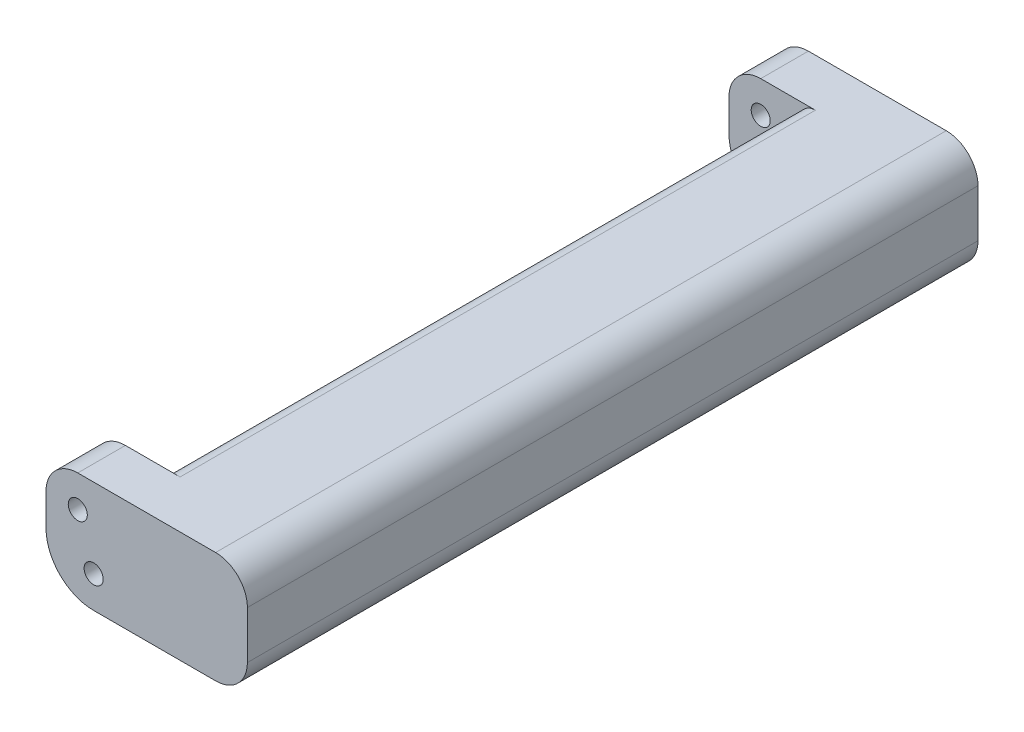
ISO-10303-21;
HEADER;
FILE_DESCRIPTION(('STEP AP214'),'2;1');
FILE_NAME('part.step','',(''),(''),'','','');
FILE_SCHEMA(('AUTOMOTIVE_DESIGN { 1 0 10303 214 1 1 1 1 }'));
ENDSEC;
DATA;
#1=APPLICATION_CONTEXT('core data for automotive mechanical design processes');
#2=APPLICATION_PROTOCOL_DEFINITION('international standard','automotive_design',2000,#1);
#3=PRODUCT_CONTEXT('',#1,'mechanical');
#4=PRODUCT('Part','Part','',(#3));
#5=PRODUCT_RELATED_PRODUCT_CATEGORY('part','',(#4));
#6=PRODUCT_DEFINITION_FORMATION('','',#4);
#7=PRODUCT_DEFINITION_CONTEXT('part definition',#1,'design');
#8=PRODUCT_DEFINITION('design','',#6,#7);
#9=PRODUCT_DEFINITION_SHAPE('','',#8);
#10=(LENGTH_UNIT() NAMED_UNIT(*) SI_UNIT(.MILLI.,.METRE.));
#11=(NAMED_UNIT(*) PLANE_ANGLE_UNIT() SI_UNIT($,.RADIAN.));
#12=(NAMED_UNIT(*) SI_UNIT($,.STERADIAN.) SOLID_ANGLE_UNIT());
#13=UNCERTAINTY_MEASURE_WITH_UNIT(LENGTH_MEASURE(1.E-05),#10,'distance_accuracy_value','');
#14=(GEOMETRIC_REPRESENTATION_CONTEXT(3) GLOBAL_UNCERTAINTY_ASSIGNED_CONTEXT((#13)) GLOBAL_UNIT_ASSIGNED_CONTEXT((#10,
#11,#12)) REPRESENTATION_CONTEXT('',''));
#15=CARTESIAN_POINT('',(0.,0.,0.));
#16=DIRECTION('',(0.,0.,1.));
#17=DIRECTION('',(1.,0.,0.));
#18=AXIS2_PLACEMENT_3D('',#15,#16,#17);
#19=CARTESIAN_POINT('',(8.50899999999999,0.,9.525));
#20=DIRECTION('',(1.,0.,0.));
#21=DIRECTION('',(0.,1.,0.));
#22=AXIS2_PLACEMENT_3D('',#19,#20,#21);
#23=PLANE('',#22);
#24=DIRECTION('',(0.,1.,0.));
#25=VECTOR('',#24,1.);
#26=CARTESIAN_POINT('',(8.50899999999999,0.,146.05));
#27=LINE('',#26,#25);
#28=CARTESIAN_POINT('',(8.50899999999999,9.52500000000001,146.05));
#29=VERTEX_POINT('',#28);
#30=CARTESIAN_POINT('',(8.50899999999999,19.05,146.05));
#31=VERTEX_POINT('',#30);
#32=EDGE_CURVE('E283',#29,#31,#27,.T.);
#33=ORIENTED_EDGE('',*,*,#32,.F.);
#34=DIRECTION('',(0.,0.,1.));
#35=VECTOR('',#34,1.);
#36=CARTESIAN_POINT('',(8.50899999999999,9.52500000000001,0.));
#37=LINE('',#36,#35);
#38=CARTESIAN_POINT('',(8.50899999999999,9.52500000000001,0.));
#39=VERTEX_POINT('',#38);
#40=EDGE_CURVE('E43',#29,#39,#37,.F.);
#41=ORIENTED_EDGE('',*,*,#40,.T.);
#42=DIRECTION('',(0.,-1.,0.));
#43=VECTOR('',#42,1.);
#44=CARTESIAN_POINT('',(8.50899999999999,0.,0.));
#45=LINE('',#44,#43);
#46=CARTESIAN_POINT('',(8.50899999999999,19.05,0.));
#47=VERTEX_POINT('',#46);
#48=EDGE_CURVE('E194',#47,#39,#45,.T.);
#49=ORIENTED_EDGE('',*,*,#48,.F.);
#50=DIRECTION('',(0.,0.,-1.));
#51=VECTOR('',#50,1.);
#52=CARTESIAN_POINT('',(8.50899999999999,19.05,9.525));
#53=LINE('',#52,#51);
#54=EDGE_CURVE('E211',#47,#31,#53,.F.);
#55=ORIENTED_EDGE('',*,*,#54,.T.);
#56=EDGE_LOOP('',(#33,#41,#49,#55));
#57=FACE_BOUND('',#56,.T.);
#58=ADVANCED_FACE('F35',(#57),#23,.T.);
#59=CARTESIAN_POINT('',(0.,25.4,9.525));
#60=DIRECTION('',(0.,1.,0.));
#61=DIRECTION('',(0.,0.,1.));
#62=AXIS2_PLACEMENT_3D('',#59,#60,#61);
#63=PLANE('',#62);
#64=DIRECTION('',(1.,0.,0.));
#65=VECTOR('',#64,1.);
#66=CARTESIAN_POINT('',(0.,25.4,9.525));
#67=LINE('',#66,#65);
#68=CARTESIAN_POINT('',(-25.4,25.4,9.525));
#69=VERTEX_POINT('',#68);
#70=CARTESIAN_POINT('',(-14.4684735135771,25.4,9.525));
#71=VERTEX_POINT('',#70);
#72=EDGE_CURVE('E186',#69,#71,#67,.T.);
#73=ORIENTED_EDGE('',*,*,#72,.T.);
#74=DIRECTION('',(0.,0.,-1.));
#75=VECTOR('',#74,1.);
#76=CARTESIAN_POINT('',(-14.4684735135771,25.4,136.525));
#77=LINE('',#76,#75);
#78=CARTESIAN_POINT('',(-14.4684735135771,25.4,136.525));
#79=VERTEX_POINT('',#78);
#80=EDGE_CURVE('E230',#71,#79,#77,.F.);
#81=ORIENTED_EDGE('',*,*,#80,.T.);
#82=DIRECTION('',(-1.,0.,0.));
#83=VECTOR('',#82,1.);
#84=CARTESIAN_POINT('',(-19.05,25.4,136.525));
#85=LINE('',#84,#83);
#86=CARTESIAN_POINT('',(-25.4,25.4,136.525));
#87=VERTEX_POINT('',#86);
#88=EDGE_CURVE('E280',#79,#87,#85,.T.);
#89=ORIENTED_EDGE('',*,*,#88,.T.);
#90=DIRECTION('',(0.,0.,-1.));
#91=VECTOR('',#90,1.);
#92=CARTESIAN_POINT('',(-25.4,25.4,146.05));
#93=LINE('',#92,#91);
#94=CARTESIAN_POINT('',(-25.4,25.4,146.05));
#95=VERTEX_POINT('',#94);
#96=EDGE_CURVE('E202',#87,#95,#93,.F.);
#97=ORIENTED_EDGE('',*,*,#96,.T.);
#98=DIRECTION('',(-1.,0.,0.));
#99=VECTOR('',#98,1.);
#100=CARTESIAN_POINT('',(8.50899999999999,25.4,146.05));
#101=LINE('',#100,#99);
#102=CARTESIAN_POINT('',(2.15899999999999,25.4,146.05));
#103=VERTEX_POINT('',#102);
#104=EDGE_CURVE('E285',#103,#95,#101,.T.);
#105=ORIENTED_EDGE('',*,*,#104,.F.);
#106=DIRECTION('',(0.,0.,-1.));
#107=VECTOR('',#106,1.);
#108=CARTESIAN_POINT('',(2.15899999999999,25.4,9.525));
#109=LINE('',#108,#107);
#110=CARTESIAN_POINT('',(2.15899999999999,25.4,0.));
#111=VERTEX_POINT('',#110);
#112=EDGE_CURVE('E204',#103,#111,#109,.T.);
#113=ORIENTED_EDGE('',*,*,#112,.T.);
#114=DIRECTION('',(1.,0.,0.));
#115=VECTOR('',#114,1.);
#116=CARTESIAN_POINT('',(0.,25.4,0.));
#117=LINE('',#116,#115);
#118=CARTESIAN_POINT('',(-25.4,25.4,0.));
#119=VERTEX_POINT('',#118);
#120=EDGE_CURVE('E196',#119,#111,#117,.T.);
#121=ORIENTED_EDGE('',*,*,#120,.F.);
#122=DIRECTION('',(0.,0.,-1.));
#123=VECTOR('',#122,1.);
#124=CARTESIAN_POINT('',(-25.4,25.4,9.525));
#125=LINE('',#124,#123);
#126=EDGE_CURVE('E190',#119,#69,#125,.F.);
#127=ORIENTED_EDGE('',*,*,#126,.T.);
#128=EDGE_LOOP('',(#73,#81,#89,#97,#105,#113,#121,#127));
#129=FACE_BOUND('',#128,.T.);
#130=ADVANCED_FACE('F309',(#129),#63,.T.);
#131=CARTESIAN_POINT('',(-31.75,0.,9.525));
#132=DIRECTION('',(1.,0.,0.));
#133=DIRECTION('',(0.,1.,0.));
#134=AXIS2_PLACEMENT_3D('',#131,#132,#133);
#135=PLANE('',#134);
#136=DIRECTION('',(0.,-1.,0.));
#137=VECTOR('',#136,1.);
#138=CARTESIAN_POINT('',(-31.75,0.,0.));
#139=LINE('',#138,#137);
#140=CARTESIAN_POINT('',(-31.75,19.05,0.));
#141=VERTEX_POINT('',#140);
#142=CARTESIAN_POINT('',(-31.75,12.7,0.));
#143=VERTEX_POINT('',#142);
#144=EDGE_CURVE('E183',#141,#143,#139,.T.);
#145=ORIENTED_EDGE('',*,*,#144,.T.);
#146=DIRECTION('',(0.,0.,1.));
#147=VECTOR('',#146,1.);
#148=CARTESIAN_POINT('',(-31.75,12.7,9.525));
#149=LINE('',#148,#147);
#150=CARTESIAN_POINT('',(-31.75,12.7,9.525));
#151=VERTEX_POINT('',#150);
#152=EDGE_CURVE('E237',#143,#151,#149,.T.);
#153=ORIENTED_EDGE('',*,*,#152,.T.);
#154=DIRECTION('',(0.,-1.,0.));
#155=VECTOR('',#154,1.);
#156=CARTESIAN_POINT('',(-31.75,0.,9.525));
#157=LINE('',#156,#155);
#158=CARTESIAN_POINT('',(-31.75,19.05,9.525));
#159=VERTEX_POINT('',#158);
#160=EDGE_CURVE('E188',#159,#151,#157,.T.);
#161=ORIENTED_EDGE('',*,*,#160,.F.);
#162=DIRECTION('',(0.,0.,-1.));
#163=VECTOR('',#162,1.);
#164=CARTESIAN_POINT('',(-31.75,19.05,0.));
#165=LINE('',#164,#163);
#166=EDGE_CURVE('E223',#159,#141,#165,.T.);
#167=ORIENTED_EDGE('',*,*,#166,.T.);
#168=EDGE_LOOP('',(#145,#153,#161,#167));
#169=FACE_BOUND('',#168,.T.);
#170=ADVANCED_FACE('F314',(#169),#135,.F.);
#171=CARTESIAN_POINT('',(-25.4,19.05,9.525));
#172=DIRECTION('',(0.,0.,-1.));
#173=DIRECTION('',(-1.,0.,0.));
#174=AXIS2_PLACEMENT_3D('',#171,#172,#173);
#175=CYLINDRICAL_SURFACE('',#174,1.905);
#176=CARTESIAN_POINT('',(-25.4,19.05,9.525));
#177=DIRECTION('',(0.,0.,1.));
#178=DIRECTION('',(1.,0.,0.));
#179=AXIS2_PLACEMENT_3D('',#176,#177,#178);
#180=CIRCLE('',#179,1.905);
#181=CARTESIAN_POINT('',(-27.305,19.05,9.525));
#182=VERTEX_POINT('',#181);
#183=EDGE_CURVE('E182',#182,#182,#180,.T.);
#184=CARTESIAN_POINT('',(-25.4,19.05,0.));
#185=DIRECTION('',(0.,0.,1.));
#186=DIRECTION('',(1.,0.,0.));
#187=AXIS2_PLACEMENT_3D('',#184,#185,#186);
#188=CIRCLE('',#187,1.905);
#189=CARTESIAN_POINT('',(-27.305,19.05,0.));
#190=VERTEX_POINT('',#189);
#191=EDGE_CURVE('E171',#190,#190,#188,.T.);
#192=CARTESIAN_POINT('',(-27.305,19.05,9.525));
#193=CARTESIAN_POINT('',(-27.305,19.05,9.42578125));
#194=CARTESIAN_POINT('',(-27.305,19.05,9.3265625));
#195=CARTESIAN_POINT('',(-27.305,19.05,9.128125));
#196=CARTESIAN_POINT('',(-27.305,19.05,9.02890625));
#197=CARTESIAN_POINT('',(-27.305,19.05,8.83046875));
#198=CARTESIAN_POINT('',(-27.305,19.05,8.73125));
#199=CARTESIAN_POINT('',(-27.305,19.05,8.5328125));
#200=CARTESIAN_POINT('',(-27.305,19.05,8.43359375));
#201=CARTESIAN_POINT('',(-27.305,19.05,8.23515625));
#202=CARTESIAN_POINT('',(-27.305,19.05,8.1359375));
#203=CARTESIAN_POINT('',(-27.305,19.05,7.9375));
#204=CARTESIAN_POINT('',(-27.305,19.05,7.83828125));
#205=CARTESIAN_POINT('',(-27.305,19.05,7.63984375));
#206=CARTESIAN_POINT('',(-27.305,19.05,7.540625));
#207=CARTESIAN_POINT('',(-27.305,19.05,7.3421875));
#208=CARTESIAN_POINT('',(-27.305,19.05,7.24296875));
#209=CARTESIAN_POINT('',(-27.305,19.05,7.04453125));
#210=CARTESIAN_POINT('',(-27.305,19.05,6.9453125));
#211=CARTESIAN_POINT('',(-27.305,19.05,6.746875));
#212=CARTESIAN_POINT('',(-27.305,19.05,6.64765625));
#213=CARTESIAN_POINT('',(-27.305,19.05,6.44921875));
#214=CARTESIAN_POINT('',(-27.305,19.05,6.35));
#215=CARTESIAN_POINT('',(-27.305,19.05,6.1515625));
#216=CARTESIAN_POINT('',(-27.305,19.05,6.05234375));
#217=CARTESIAN_POINT('',(-27.305,19.05,5.85390625));
#218=CARTESIAN_POINT('',(-27.305,19.05,5.7546875));
#219=CARTESIAN_POINT('',(-27.305,19.05,5.55625));
#220=CARTESIAN_POINT('',(-27.305,19.05,5.45703125));
#221=CARTESIAN_POINT('',(-27.305,19.05,5.25859375));
#222=CARTESIAN_POINT('',(-27.305,19.05,5.159375));
#223=CARTESIAN_POINT('',(-27.305,19.05,4.9609375));
#224=CARTESIAN_POINT('',(-27.305,19.05,4.86171875));
#225=CARTESIAN_POINT('',(-27.305,19.05,4.66328125));
#226=CARTESIAN_POINT('',(-27.305,19.05,4.5640625));
#227=CARTESIAN_POINT('',(-27.305,19.05,4.365625));
#228=CARTESIAN_POINT('',(-27.305,19.05,4.26640625));
#229=CARTESIAN_POINT('',(-27.305,19.05,4.06796875));
#230=CARTESIAN_POINT('',(-27.305,19.05,3.96875));
#231=CARTESIAN_POINT('',(-27.305,19.05,3.7703125));
#232=CARTESIAN_POINT('',(-27.305,19.05,3.67109375));
#233=CARTESIAN_POINT('',(-27.305,19.05,3.47265625));
#234=CARTESIAN_POINT('',(-27.305,19.05,3.3734375));
#235=CARTESIAN_POINT('',(-27.305,19.05,3.175));
#236=CARTESIAN_POINT('',(-27.305,19.05,3.07578125));
#237=CARTESIAN_POINT('',(-27.305,19.05,2.87734375));
#238=CARTESIAN_POINT('',(-27.305,19.05,2.778125));
#239=CARTESIAN_POINT('',(-27.305,19.05,2.5796875));
#240=CARTESIAN_POINT('',(-27.305,19.05,2.48046875));
#241=CARTESIAN_POINT('',(-27.305,19.05,2.28203125));
#242=CARTESIAN_POINT('',(-27.305,19.05,2.1828125));
#243=CARTESIAN_POINT('',(-27.305,19.05,1.984375));
#244=CARTESIAN_POINT('',(-27.305,19.05,1.88515625));
#245=CARTESIAN_POINT('',(-27.305,19.05,1.68671875));
#246=CARTESIAN_POINT('',(-27.305,19.05,1.5875));
#247=CARTESIAN_POINT('',(-27.305,19.05,1.3890625));
#248=CARTESIAN_POINT('',(-27.305,19.05,1.28984375));
#249=CARTESIAN_POINT('',(-27.305,19.05,1.09140625));
#250=CARTESIAN_POINT('',(-27.305,19.05,0.992187500000001));
#251=CARTESIAN_POINT('',(-27.305,19.05,0.793750000000001));
#252=CARTESIAN_POINT('',(-27.305,19.05,0.69453125));
#253=CARTESIAN_POINT('',(-27.305,19.05,0.49609375));
#254=CARTESIAN_POINT('',(-27.305,19.05,0.396875));
#255=CARTESIAN_POINT('',(-27.305,19.05,0.1984375));
#256=CARTESIAN_POINT('',(-27.305,19.05,0.0992187500000001));
#257=CARTESIAN_POINT('',(-27.305,19.05,0.));
#258=B_SPLINE_CURVE_WITH_KNOTS('',3,(#192,#193,#194,#195,#196,#197,#198,#199,#200,#201,#202,
#203,#204,#205,#206,#207,#208,#209,#210,#211,#212,#213,#214,#215,#216,#217,#218,#219,#220,#221,
#222,#223,#224,#225,#226,#227,#228,#229,#230,#231,#232,#233,#234,#235,#236,#237,#238,#239,#240,
#241,#242,#243,#244,#245,#246,#247,#248,#249,#250,#251,#252,#253,#254,#255,#256,#257),
.UNSPECIFIED.,.F.,.F.,(4,2,2,2,2,2,2,2,2,2,2,2,2,2,2,2,2,2,2,2,2,2,2,2,2,2,2,2,2,2,2,2,4),(0.,
0.29765625,0.5953125,0.892968750000001,1.190625,1.48828125,1.7859375,2.08359375,2.38125,
2.67890625,2.9765625,3.27421875,3.571875,3.86953125,4.1671875,4.46484375,4.7625,5.06015625,
5.3578125,5.65546875,5.953125,6.25078125,6.5484375,6.84609375,7.14375,7.44140625,7.7390625,
8.03671875,8.334375,8.63203125,8.9296875,9.22734375,9.525),.UNSPECIFIED.);
#259=EDGE_CURVE('BSEAM318',#182,#190,#258,.T.);
#260=ORIENTED_EDGE('',*,*,#183,.T.);
#261=ORIENTED_EDGE('',*,*,#191,.F.);
#262=ORIENTED_EDGE('',*,*,#259,.T.);
#263=ORIENTED_EDGE('',*,*,#259,.F.);
#264=EDGE_LOOP('',(#260,#262,#261,#263));
#265=FACE_BOUND('',#264,.T.);
#266=ADVANCED_FACE('F318',(#265),#175,.F.);
#267=CARTESIAN_POINT('',(-22.225,9.525,9.525));
#268=DIRECTION('',(0.,0.,-1.));
#269=DIRECTION('',(-1.,0.,0.));
#270=AXIS2_PLACEMENT_3D('',#267,#268,#269);
#271=CYLINDRICAL_SURFACE('',#270,1.905);
#272=CARTESIAN_POINT('',(-22.225,9.525,9.525));
#273=DIRECTION('',(0.,0.,1.));
#274=DIRECTION('',(1.,0.,0.));
#275=AXIS2_PLACEMENT_3D('',#272,#273,#274);
#276=CIRCLE('',#275,1.905);
#277=CARTESIAN_POINT('',(-24.13,9.525,9.525));
#278=VERTEX_POINT('',#277);
#279=EDGE_CURVE('E179',#278,#278,#276,.T.);
#280=CARTESIAN_POINT('',(-22.225,9.525,0.));
#281=DIRECTION('',(0.,0.,1.));
#282=DIRECTION('',(1.,0.,0.));
#283=AXIS2_PLACEMENT_3D('',#280,#281,#282);
#284=CIRCLE('',#283,1.905);
#285=CARTESIAN_POINT('',(-24.13,9.525,0.));
#286=VERTEX_POINT('',#285);
#287=EDGE_CURVE('E168',#286,#286,#284,.T.);
#288=CARTESIAN_POINT('',(-24.13,9.525,9.525));
#289=CARTESIAN_POINT('',(-24.13,9.525,9.42578125));
#290=CARTESIAN_POINT('',(-24.13,9.525,9.3265625));
#291=CARTESIAN_POINT('',(-24.13,9.525,9.128125));
#292=CARTESIAN_POINT('',(-24.13,9.525,9.02890625));
#293=CARTESIAN_POINT('',(-24.13,9.525,8.83046875));
#294=CARTESIAN_POINT('',(-24.13,9.525,8.73125));
#295=CARTESIAN_POINT('',(-24.13,9.525,8.5328125));
#296=CARTESIAN_POINT('',(-24.13,9.525,8.43359375));
#297=CARTESIAN_POINT('',(-24.13,9.525,8.23515625));
#298=CARTESIAN_POINT('',(-24.13,9.525,8.1359375));
#299=CARTESIAN_POINT('',(-24.13,9.525,7.9375));
#300=CARTESIAN_POINT('',(-24.13,9.525,7.83828125));
#301=CARTESIAN_POINT('',(-24.13,9.525,7.63984375));
#302=CARTESIAN_POINT('',(-24.13,9.525,7.540625));
#303=CARTESIAN_POINT('',(-24.13,9.525,7.3421875));
#304=CARTESIAN_POINT('',(-24.13,9.525,7.24296875));
#305=CARTESIAN_POINT('',(-24.13,9.525,7.04453125));
#306=CARTESIAN_POINT('',(-24.13,9.525,6.9453125));
#307=CARTESIAN_POINT('',(-24.13,9.525,6.746875));
#308=CARTESIAN_POINT('',(-24.13,9.525,6.64765625));
#309=CARTESIAN_POINT('',(-24.13,9.525,6.44921875));
#310=CARTESIAN_POINT('',(-24.13,9.525,6.35));
#311=CARTESIAN_POINT('',(-24.13,9.525,6.1515625));
#312=CARTESIAN_POINT('',(-24.13,9.525,6.05234375));
#313=CARTESIAN_POINT('',(-24.13,9.525,5.85390625));
#314=CARTESIAN_POINT('',(-24.13,9.525,5.7546875));
#315=CARTESIAN_POINT('',(-24.13,9.525,5.55625));
#316=CARTESIAN_POINT('',(-24.13,9.525,5.45703125));
#317=CARTESIAN_POINT('',(-24.13,9.525,5.25859375));
#318=CARTESIAN_POINT('',(-24.13,9.525,5.159375));
#319=CARTESIAN_POINT('',(-24.13,9.525,4.9609375));
#320=CARTESIAN_POINT('',(-24.13,9.525,4.86171875));
#321=CARTESIAN_POINT('',(-24.13,9.525,4.66328125));
#322=CARTESIAN_POINT('',(-24.13,9.525,4.5640625));
#323=CARTESIAN_POINT('',(-24.13,9.525,4.365625));
#324=CARTESIAN_POINT('',(-24.13,9.525,4.26640625));
#325=CARTESIAN_POINT('',(-24.13,9.525,4.06796875));
#326=CARTESIAN_POINT('',(-24.13,9.525,3.96875));
#327=CARTESIAN_POINT('',(-24.13,9.525,3.7703125));
#328=CARTESIAN_POINT('',(-24.13,9.525,3.67109375));
#329=CARTESIAN_POINT('',(-24.13,9.525,3.47265625));
#330=CARTESIAN_POINT('',(-24.13,9.525,3.3734375));
#331=CARTESIAN_POINT('',(-24.13,9.525,3.175));
#332=CARTESIAN_POINT('',(-24.13,9.525,3.07578125));
#333=CARTESIAN_POINT('',(-24.13,9.525,2.87734375));
#334=CARTESIAN_POINT('',(-24.13,9.525,2.778125));
#335=CARTESIAN_POINT('',(-24.13,9.525,2.5796875));
#336=CARTESIAN_POINT('',(-24.13,9.525,2.48046875));
#337=CARTESIAN_POINT('',(-24.13,9.525,2.28203125));
#338=CARTESIAN_POINT('',(-24.13,9.525,2.1828125));
#339=CARTESIAN_POINT('',(-24.13,9.525,1.984375));
#340=CARTESIAN_POINT('',(-24.13,9.525,1.88515625));
#341=CARTESIAN_POINT('',(-24.13,9.525,1.68671875));
#342=CARTESIAN_POINT('',(-24.13,9.525,1.5875));
#343=CARTESIAN_POINT('',(-24.13,9.525,1.3890625));
#344=CARTESIAN_POINT('',(-24.13,9.525,1.28984375));
#345=CARTESIAN_POINT('',(-24.13,9.525,1.09140625));
#346=CARTESIAN_POINT('',(-24.13,9.525,0.992187500000001));
#347=CARTESIAN_POINT('',(-24.13,9.525,0.793750000000001));
#348=CARTESIAN_POINT('',(-24.13,9.525,0.69453125));
#349=CARTESIAN_POINT('',(-24.13,9.525,0.49609375));
#350=CARTESIAN_POINT('',(-24.13,9.525,0.396875));
#351=CARTESIAN_POINT('',(-24.13,9.525,0.1984375));
#352=CARTESIAN_POINT('',(-24.13,9.525,0.0992187500000001));
#353=CARTESIAN_POINT('',(-24.13,9.525,0.));
#354=B_SPLINE_CURVE_WITH_KNOTS('',3,(#288,#289,#290,#291,#292,#293,#294,#295,#296,#297,#298,
#299,#300,#301,#302,#303,#304,#305,#306,#307,#308,#309,#310,#311,#312,#313,#314,#315,#316,#317,
#318,#319,#320,#321,#322,#323,#324,#325,#326,#327,#328,#329,#330,#331,#332,#333,#334,#335,#336,
#337,#338,#339,#340,#341,#342,#343,#344,#345,#346,#347,#348,#349,#350,#351,#352,#353),
.UNSPECIFIED.,.F.,.F.,(4,2,2,2,2,2,2,2,2,2,2,2,2,2,2,2,2,2,2,2,2,2,2,2,2,2,2,2,2,2,2,2,4),(0.,
0.29765625,0.5953125,0.892968750000001,1.190625,1.48828125,1.7859375,2.08359375,2.38125,
2.67890625,2.9765625,3.27421875,3.571875,3.86953125,4.1671875,4.46484375,4.7625,5.06015625,
5.3578125,5.65546875,5.953125,6.25078125,6.5484375,6.84609375,7.14375,7.44140625,7.7390625,
8.03671875,8.334375,8.63203125,8.9296875,9.22734375,9.525),.UNSPECIFIED.);
#355=EDGE_CURVE('BSEAM321',#278,#286,#354,.T.);
#356=ORIENTED_EDGE('',*,*,#279,.T.);
#357=ORIENTED_EDGE('',*,*,#287,.F.);
#358=ORIENTED_EDGE('',*,*,#355,.T.);
#359=ORIENTED_EDGE('',*,*,#355,.F.);
#360=EDGE_LOOP('',(#356,#358,#357,#359));
#361=FACE_BOUND('',#360,.T.);
#362=ADVANCED_FACE('F321',(#361),#271,.F.);
#363=CARTESIAN_POINT('',(0.,0.,9.525));
#364=DIRECTION('',(0.,0.,1.));
#365=DIRECTION('',(1.,0.,0.));
#366=AXIS2_PLACEMENT_3D('',#363,#364,#365);
#367=PLANE('',#366);
#368=ORIENTED_EDGE('',*,*,#160,.T.);
#369=CARTESIAN_POINT('',(-22.225,12.7,9.525));
#370=DIRECTION('',(0.,0.,1.));
#371=DIRECTION('',(1.,0.,0.));
#372=AXIS2_PLACEMENT_3D('',#369,#370,#371);
#373=CIRCLE('',#372,9.525);
#374=CARTESIAN_POINT('',(-22.225,3.175,9.525));
#375=VERTEX_POINT('',#374);
#376=EDGE_CURVE('E240',#151,#375,#373,.T.);
#377=ORIENTED_EDGE('',*,*,#376,.T.);
#378=DIRECTION('',(-1.,0.,0.));
#379=VECTOR('',#378,1.);
#380=CARTESIAN_POINT('',(0.,3.17500000000001,9.525));
#381=LINE('',#380,#379);
#382=CARTESIAN_POINT('',(-10.715625,3.175,9.52500000000001));
#383=VERTEX_POINT('',#382);
#384=EDGE_CURVE('E163',#383,#375,#381,.T.);
#385=ORIENTED_EDGE('',*,*,#384,.F.);
#386=DIRECTION('',(0.351123441588392,-0.936329177569044,0.));
#387=VECTOR('',#386,1.);
#388=CARTESIAN_POINT('',(-19.05,25.4,9.525));
#389=LINE('',#388,#387);
#390=CARTESIAN_POINT('',(-17.4413186523588,21.1101830729569,9.525));
#391=VERTEX_POINT('',#390);
#392=EDGE_CURVE('E162',#391,#383,#389,.T.);
#393=ORIENTED_EDGE('',*,*,#392,.F.);
#394=CARTESIAN_POINT('',(-14.4684735135771,22.225,9.52500000000001));
#395=DIRECTION('',(0.,0.,1.));
#396=DIRECTION('',(1.,0.,0.));
#397=AXIS2_PLACEMENT_3D('',#394,#395,#396);
#398=CIRCLE('',#397,3.175);
#399=EDGE_CURVE('E233',#391,#71,#398,.F.);
#400=ORIENTED_EDGE('',*,*,#399,.T.);
#401=ORIENTED_EDGE('',*,*,#72,.F.);
#402=CARTESIAN_POINT('',(-25.4,19.05,9.525));
#403=DIRECTION('',(0.,0.,1.));
#404=DIRECTION('',(1.,0.,0.));
#405=AXIS2_PLACEMENT_3D('',#402,#403,#404);
#406=CIRCLE('',#405,6.35);
#407=EDGE_CURVE('E226',#69,#159,#406,.T.);
#408=ORIENTED_EDGE('',*,*,#407,.T.);
#409=EDGE_LOOP('',(#368,#377,#385,#393,#400,#401,#408));
#410=FACE_BOUND('',#409,.T.);
#411=ORIENTED_EDGE('',*,*,#279,.F.);
#412=EDGE_LOOP('',(#411));
#413=FACE_BOUND('',#412,.T.);
#414=ORIENTED_EDGE('',*,*,#183,.F.);
#415=EDGE_LOOP('',(#414));
#416=FACE_BOUND('',#415,.T.);
#417=ADVANCED_FACE('F325',(#410,#413,#416),#367,.T.);
#418=CARTESIAN_POINT('',(0.,0.,0.));
#419=DIRECTION('',(0.,0.,1.));
#420=DIRECTION('',(1.,0.,0.));
#421=AXIS2_PLACEMENT_3D('',#418,#419,#420);
#422=PLANE('',#421);
#423=ORIENTED_EDGE('',*,*,#287,.T.);
#424=EDGE_LOOP('',(#423));
#425=FACE_BOUND('',#424,.T.);
#426=ORIENTED_EDGE('',*,*,#191,.T.);
#427=EDGE_LOOP('',(#426));
#428=FACE_BOUND('',#427,.T.);
#429=ORIENTED_EDGE('',*,*,#48,.T.);
#430=CARTESIAN_POINT('',(2.15899999999999,9.52500000000001,0.));
#431=DIRECTION('',(0.,0.,1.));
#432=DIRECTION('',(1.,0.,0.));
#433=AXIS2_PLACEMENT_3D('',#430,#431,#432);
#434=CIRCLE('',#433,6.35);
#435=CARTESIAN_POINT('',(2.15899999999999,3.17500000000001,0.));
#436=VERTEX_POINT('',#435);
#437=EDGE_CURVE('E11',#39,#436,#434,.F.);
#438=ORIENTED_EDGE('',*,*,#437,.T.);
#439=DIRECTION('',(1.,0.,0.));
#440=VECTOR('',#439,1.);
#441=CARTESIAN_POINT('',(0.,3.17500000000001,0.));
#442=LINE('',#441,#440);
#443=CARTESIAN_POINT('',(-22.225,3.175,0.));
#444=VERTEX_POINT('',#443);
#445=EDGE_CURVE('E152',#444,#436,#442,.T.);
#446=ORIENTED_EDGE('',*,*,#445,.F.);
#447=CARTESIAN_POINT('',(-22.225,12.7,0.));
#448=DIRECTION('',(0.,0.,1.));
#449=DIRECTION('',(1.,0.,0.));
#450=AXIS2_PLACEMENT_3D('',#447,#448,#449);
#451=CIRCLE('',#450,9.525);
#452=EDGE_CURVE('E245',#444,#143,#451,.F.);
#453=ORIENTED_EDGE('',*,*,#452,.T.);
#454=ORIENTED_EDGE('',*,*,#144,.F.);
#455=CARTESIAN_POINT('',(-25.4,19.05,0.));
#456=DIRECTION('',(0.,0.,1.));
#457=DIRECTION('',(1.,0.,0.));
#458=AXIS2_PLACEMENT_3D('',#455,#456,#457);
#459=CIRCLE('',#458,6.35);
#460=EDGE_CURVE('E207',#141,#119,#459,.F.);
#461=ORIENTED_EDGE('',*,*,#460,.T.);
#462=ORIENTED_EDGE('',*,*,#120,.T.);
#463=CARTESIAN_POINT('',(2.15899999999999,19.05,0.));
#464=DIRECTION('',(0.,0.,1.));
#465=DIRECTION('',(1.,0.,0.));
#466=AXIS2_PLACEMENT_3D('',#463,#464,#465);
#467=CIRCLE('',#466,6.35);
#468=EDGE_CURVE('E209',#111,#47,#467,.F.);
#469=ORIENTED_EDGE('',*,*,#468,.T.);
#470=EDGE_LOOP('',(#429,#438,#446,#453,#454,#461,#462,#469));
#471=FACE_BOUND('',#470,.T.);
#472=ADVANCED_FACE('F356',(#425,#428,#471),#422,.F.);
#473=CARTESIAN_POINT('',(-19.05,25.4,136.525));
#474=DIRECTION('',(0.936329177569044,0.351123441588392,0.));
#475=DIRECTION('',(-0.351123441588392,0.936329177569045,0.));
#476=AXIS2_PLACEMENT_3D('',#473,#474,#475);
#477=PLANE('',#476);
#478=ORIENTED_EDGE('',*,*,#392,.T.);
#479=DIRECTION('',(0.,0.,1.));
#480=VECTOR('',#479,1.);
#481=CARTESIAN_POINT('',(-10.715625,3.175,136.525));
#482=LINE('',#481,#480);
#483=CARTESIAN_POINT('',(-10.715625,3.175,136.525));
#484=VERTEX_POINT('',#483);
#485=EDGE_CURVE('E145',#383,#484,#482,.T.);
#486=ORIENTED_EDGE('',*,*,#485,.T.);
#487=DIRECTION('',(0.351123441588392,-0.936329177569044,0.));
#488=VECTOR('',#487,1.);
#489=CARTESIAN_POINT('',(-19.05,25.4,136.525));
#490=LINE('',#489,#488);
#491=CARTESIAN_POINT('',(-17.4413186523588,21.1101830729569,136.525));
#492=VERTEX_POINT('',#491);
#493=EDGE_CURVE('E159',#492,#484,#490,.T.);
#494=ORIENTED_EDGE('',*,*,#493,.F.);
#495=DIRECTION('',(0.,0.,-1.));
#496=VECTOR('',#495,1.);
#497=CARTESIAN_POINT('',(-17.4413186523588,21.1101830729569,9.52500000000006));
#498=LINE('',#497,#496);
#499=EDGE_CURVE('E228',#492,#391,#498,.T.);
#500=ORIENTED_EDGE('',*,*,#499,.T.);
#501=EDGE_LOOP('',(#478,#486,#494,#500));
#502=FACE_BOUND('',#501,.T.);
#503=ADVANCED_FACE('F157',(#502),#477,.F.);
#504=CARTESIAN_POINT('',(0.,0.,136.525));
#505=DIRECTION('',(0.,0.,1.));
#506=DIRECTION('',(1.,0.,0.));
#507=AXIS2_PLACEMENT_3D('',#504,#505,#506);
#508=PLANE('',#507);
#509=CARTESIAN_POINT('',(-25.4,19.05,136.525));
#510=DIRECTION('',(0.,0.,1.));
#511=DIRECTION('',(1.,0.,0.));
#512=AXIS2_PLACEMENT_3D('',#509,#510,#511);
#513=CIRCLE('',#512,1.905);
#514=CARTESIAN_POINT('',(-27.305,19.05,136.525));
#515=VERTEX_POINT('',#514);
#516=EDGE_CURVE('E274',#515,#515,#513,.T.);
#517=ORIENTED_EDGE('',*,*,#516,.T.);
#518=EDGE_LOOP('',(#517));
#519=FACE_BOUND('',#518,.T.);
#520=CARTESIAN_POINT('',(-22.225,9.525,136.525));
#521=DIRECTION('',(0.,0.,1.));
#522=DIRECTION('',(1.,0.,0.));
#523=AXIS2_PLACEMENT_3D('',#520,#521,#522);
#524=CIRCLE('',#523,1.905);
#525=CARTESIAN_POINT('',(-24.13,9.525,136.525));
#526=VERTEX_POINT('',#525);
#527=EDGE_CURVE('E270',#526,#526,#524,.T.);
#528=ORIENTED_EDGE('',*,*,#527,.T.);
#529=EDGE_LOOP('',(#528));
#530=FACE_BOUND('',#529,.T.);
#531=DIRECTION('',(-1.,0.,0.));
#532=VECTOR('',#531,1.);
#533=CARTESIAN_POINT('',(0.,3.17500000000001,136.525));
#534=LINE('',#533,#532);
#535=CARTESIAN_POINT('',(-22.225,3.175,136.525));
#536=VERTEX_POINT('',#535);
#537=EDGE_CURVE('E140',#484,#536,#534,.T.);
#538=ORIENTED_EDGE('',*,*,#537,.T.);
#539=CARTESIAN_POINT('',(-22.225,12.7,136.525));
#540=DIRECTION('',(0.,0.,1.));
#541=DIRECTION('',(1.,0.,0.));
#542=AXIS2_PLACEMENT_3D('',#539,#540,#541);
#543=CIRCLE('',#542,9.525);
#544=CARTESIAN_POINT('',(-31.75,12.7,136.525));
#545=VERTEX_POINT('',#544);
#546=EDGE_CURVE('E253',#536,#545,#543,.F.);
#547=ORIENTED_EDGE('',*,*,#546,.T.);
#548=DIRECTION('',(0.,-1.,0.));
#549=VECTOR('',#548,1.);
#550=CARTESIAN_POINT('',(-31.75,25.4,136.525));
#551=LINE('',#550,#549);
#552=CARTESIAN_POINT('',(-31.75,19.05,136.525));
#553=VERTEX_POINT('',#552);
#554=EDGE_CURVE('E176',#553,#545,#551,.T.);
#555=ORIENTED_EDGE('',*,*,#554,.F.);
#556=CARTESIAN_POINT('',(-25.4,19.05,136.525));
#557=DIRECTION('',(0.,0.,1.));
#558=DIRECTION('',(1.,0.,0.));
#559=AXIS2_PLACEMENT_3D('',#556,#557,#558);
#560=CIRCLE('',#559,6.35);
#561=EDGE_CURVE('E221',#553,#87,#560,.F.);
#562=ORIENTED_EDGE('',*,*,#561,.T.);
#563=ORIENTED_EDGE('',*,*,#88,.F.);
#564=CARTESIAN_POINT('',(-14.4684735135771,22.225,136.525));
#565=DIRECTION('',(0.,0.,1.));
#566=DIRECTION('',(1.,0.,0.));
#567=AXIS2_PLACEMENT_3D('',#564,#565,#566);
#568=CIRCLE('',#567,3.175);
#569=EDGE_CURVE('E167',#79,#492,#568,.T.);
#570=ORIENTED_EDGE('',*,*,#569,.T.);
#571=ORIENTED_EDGE('',*,*,#493,.T.);
#572=EDGE_LOOP('',(#538,#547,#555,#562,#563,#570,#571));
#573=FACE_BOUND('',#572,.T.);
#574=ADVANCED_FACE('F165',(#519,#530,#573),#508,.F.);
#575=CARTESIAN_POINT('',(0.,0.,146.05));
#576=DIRECTION('',(0.,0.,1.));
#577=DIRECTION('',(1.,0.,0.));
#578=AXIS2_PLACEMENT_3D('',#575,#576,#577);
#579=PLANE('',#578);
#580=DIRECTION('',(-1.,0.,0.));
#581=VECTOR('',#580,1.);
#582=CARTESIAN_POINT('',(0.,3.17500000000001,146.05));
#583=LINE('',#582,#581);
#584=CARTESIAN_POINT('',(2.15899999999999,3.17500000000001,146.05));
#585=VERTEX_POINT('',#584);
#586=CARTESIAN_POINT('',(-22.225,3.175,146.05));
#587=VERTEX_POINT('',#586);
#588=EDGE_CURVE('E259',#585,#587,#583,.T.);
#589=ORIENTED_EDGE('',*,*,#588,.F.);
#590=CARTESIAN_POINT('',(2.15899999999999,9.52500000000001,146.05));
#591=DIRECTION('',(0.,0.,1.));
#592=DIRECTION('',(1.,0.,0.));
#593=AXIS2_PLACEMENT_3D('',#590,#591,#592);
#594=CIRCLE('',#593,6.35);
#595=EDGE_CURVE('E57',#585,#29,#594,.T.);
#596=ORIENTED_EDGE('',*,*,#595,.T.);
#597=ORIENTED_EDGE('',*,*,#32,.T.);
#598=CARTESIAN_POINT('',(2.15899999999999,19.05,146.05));
#599=DIRECTION('',(0.,0.,1.));
#600=DIRECTION('',(1.,0.,0.));
#601=AXIS2_PLACEMENT_3D('',#598,#599,#600);
#602=CIRCLE('',#601,6.35);
#603=EDGE_CURVE('E216',#31,#103,#602,.T.);
#604=ORIENTED_EDGE('',*,*,#603,.T.);
#605=ORIENTED_EDGE('',*,*,#104,.T.);
#606=CARTESIAN_POINT('',(-25.4,19.05,146.05));
#607=DIRECTION('',(0.,0.,1.));
#608=DIRECTION('',(1.,0.,0.));
#609=AXIS2_PLACEMENT_3D('',#606,#607,#608);
#610=CIRCLE('',#609,6.35);
#611=CARTESIAN_POINT('',(-31.75,19.05,146.05));
#612=VERTEX_POINT('',#611);
#613=EDGE_CURVE('E214',#95,#612,#610,.T.);
#614=ORIENTED_EDGE('',*,*,#613,.T.);
#615=DIRECTION('',(0.,-1.,0.));
#616=VECTOR('',#615,1.);
#617=CARTESIAN_POINT('',(-31.75,25.4,146.05));
#618=LINE('',#617,#616);
#619=CARTESIAN_POINT('',(-31.75,12.7,146.05));
#620=VERTEX_POINT('',#619);
#621=EDGE_CURVE('E173',#612,#620,#618,.T.);
#622=ORIENTED_EDGE('',*,*,#621,.T.);
#623=CARTESIAN_POINT('',(-22.225,12.7,146.05));
#624=DIRECTION('',(0.,0.,1.));
#625=DIRECTION('',(1.,0.,0.));
#626=AXIS2_PLACEMENT_3D('',#623,#624,#625);
#627=CIRCLE('',#626,9.525);
#628=EDGE_CURVE('E250',#620,#587,#627,.T.);
#629=ORIENTED_EDGE('',*,*,#628,.T.);
#630=EDGE_LOOP('',(#589,#596,#597,#604,#605,#614,#622,#629));
#631=FACE_BOUND('',#630,.T.);
#632=CARTESIAN_POINT('',(-25.4,19.05,146.05));
#633=DIRECTION('',(0.,0.,1.));
#634=DIRECTION('',(1.,0.,0.));
#635=AXIS2_PLACEMENT_3D('',#632,#633,#634);
#636=CIRCLE('',#635,1.905);
#637=CARTESIAN_POINT('',(-27.305,19.05,146.05));
#638=VERTEX_POINT('',#637);
#639=EDGE_CURVE('E277',#638,#638,#636,.T.);
#640=ORIENTED_EDGE('',*,*,#639,.F.);
#641=EDGE_LOOP('',(#640));
#642=FACE_BOUND('',#641,.T.);
#643=CARTESIAN_POINT('',(-22.225,9.525,146.05));
#644=DIRECTION('',(0.,0.,1.));
#645=DIRECTION('',(1.,0.,0.));
#646=AXIS2_PLACEMENT_3D('',#643,#644,#645);
#647=CIRCLE('',#646,1.905);
#648=CARTESIAN_POINT('',(-24.13,9.525,146.05));
#649=VERTEX_POINT('',#648);
#650=EDGE_CURVE('E271',#649,#649,#647,.T.);
#651=ORIENTED_EDGE('',*,*,#650,.F.);
#652=EDGE_LOOP('',(#651));
#653=FACE_BOUND('',#652,.T.);
#654=ADVANCED_FACE('F263',(#631,#642,#653),#579,.T.);
#655=CARTESIAN_POINT('',(-31.75,25.4,146.05));
#656=DIRECTION('',(1.,0.,0.));
#657=DIRECTION('',(0.,1.,0.));
#658=AXIS2_PLACEMENT_3D('',#655,#656,#657);
#659=PLANE('',#658);
#660=ORIENTED_EDGE('',*,*,#554,.T.);
#661=DIRECTION('',(0.,0.,1.));
#662=VECTOR('',#661,1.);
#663=CARTESIAN_POINT('',(-31.75,12.7,146.05));
#664=LINE('',#663,#662);
#665=EDGE_CURVE('E247',#545,#620,#664,.T.);
#666=ORIENTED_EDGE('',*,*,#665,.T.);
#667=ORIENTED_EDGE('',*,*,#621,.F.);
#668=DIRECTION('',(0.,0.,-1.));
#669=VECTOR('',#668,1.);
#670=CARTESIAN_POINT('',(-31.75,19.05,136.525));
#671=LINE('',#670,#669);
#672=EDGE_CURVE('E218',#612,#553,#671,.T.);
#673=ORIENTED_EDGE('',*,*,#672,.T.);
#674=EDGE_LOOP('',(#660,#666,#667,#673));
#675=FACE_BOUND('',#674,.T.);
#676=ADVANCED_FACE('F295',(#675),#659,.F.);
#677=CARTESIAN_POINT('',(-25.4,19.05,146.05));
#678=DIRECTION('',(0.,0.,-1.));
#679=DIRECTION('',(-1.,0.,0.));
#680=AXIS2_PLACEMENT_3D('',#677,#678,#679);
#681=CYLINDRICAL_SURFACE('',#680,1.905);
#682=CARTESIAN_POINT('',(-27.305,19.05,146.05));
#683=CARTESIAN_POINT('',(-27.305,19.05,145.95078125));
#684=CARTESIAN_POINT('',(-27.305,19.05,145.8515625));
#685=CARTESIAN_POINT('',(-27.305,19.05,145.653125));
#686=CARTESIAN_POINT('',(-27.305,19.05,145.55390625));
#687=CARTESIAN_POINT('',(-27.305,19.05,145.35546875));
#688=CARTESIAN_POINT('',(-27.305,19.05,145.25625));
#689=CARTESIAN_POINT('',(-27.305,19.05,145.0578125));
#690=CARTESIAN_POINT('',(-27.305,19.05,144.95859375));
#691=CARTESIAN_POINT('',(-27.305,19.05,144.76015625));
#692=CARTESIAN_POINT('',(-27.305,19.05,144.6609375));
#693=CARTESIAN_POINT('',(-27.305,19.05,144.4625));
#694=CARTESIAN_POINT('',(-27.305,19.05,144.36328125));
#695=CARTESIAN_POINT('',(-27.305,19.05,144.16484375));
#696=CARTESIAN_POINT('',(-27.305,19.05,144.065625));
#697=CARTESIAN_POINT('',(-27.305,19.05,143.8671875));
#698=CARTESIAN_POINT('',(-27.305,19.05,143.76796875));
#699=CARTESIAN_POINT('',(-27.305,19.05,143.56953125));
#700=CARTESIAN_POINT('',(-27.305,19.05,143.4703125));
#701=CARTESIAN_POINT('',(-27.305,19.05,143.271875));
#702=CARTESIAN_POINT('',(-27.305,19.05,143.17265625));
#703=CARTESIAN_POINT('',(-27.305,19.05,142.97421875));
#704=CARTESIAN_POINT('',(-27.305,19.05,142.875));
#705=CARTESIAN_POINT('',(-27.305,19.05,142.6765625));
#706=CARTESIAN_POINT('',(-27.305,19.05,142.57734375));
#707=CARTESIAN_POINT('',(-27.305,19.05,142.37890625));
#708=CARTESIAN_POINT('',(-27.305,19.05,142.2796875));
#709=CARTESIAN_POINT('',(-27.305,19.05,142.08125));
#710=CARTESIAN_POINT('',(-27.305,19.05,141.98203125));
#711=CARTESIAN_POINT('',(-27.305,19.05,141.78359375));
#712=CARTESIAN_POINT('',(-27.305,19.05,141.684375));
#713=CARTESIAN_POINT('',(-27.305,19.05,141.4859375));
#714=CARTESIAN_POINT('',(-27.305,19.05,141.38671875));
#715=CARTESIAN_POINT('',(-27.305,19.05,141.18828125));
#716=CARTESIAN_POINT('',(-27.305,19.05,141.0890625));
#717=CARTESIAN_POINT('',(-27.305,19.05,140.890625));
#718=CARTESIAN_POINT('',(-27.305,19.05,140.79140625));
#719=CARTESIAN_POINT('',(-27.305,19.05,140.59296875));
#720=CARTESIAN_POINT('',(-27.305,19.05,140.49375));
#721=CARTESIAN_POINT('',(-27.305,19.05,140.2953125));
#722=CARTESIAN_POINT('',(-27.305,19.05,140.19609375));
#723=CARTESIAN_POINT('',(-27.305,19.05,139.99765625));
#724=CARTESIAN_POINT('',(-27.305,19.05,139.8984375));
#725=CARTESIAN_POINT('',(-27.305,19.05,139.7));
#726=CARTESIAN_POINT('',(-27.305,19.05,139.60078125));
#727=CARTESIAN_POINT('',(-27.305,19.05,139.40234375));
#728=CARTESIAN_POINT('',(-27.305,19.05,139.303125));
#729=CARTESIAN_POINT('',(-27.305,19.05,139.1046875));
#730=CARTESIAN_POINT('',(-27.305,19.05,139.00546875));
#731=CARTESIAN_POINT('',(-27.305,19.05,138.80703125));
#732=CARTESIAN_POINT('',(-27.305,19.05,138.7078125));
#733=CARTESIAN_POINT('',(-27.305,19.05,138.509375));
#734=CARTESIAN_POINT('',(-27.305,19.05,138.41015625));
#735=CARTESIAN_POINT('',(-27.305,19.05,138.21171875));
#736=CARTESIAN_POINT('',(-27.305,19.05,138.1125));
#737=CARTESIAN_POINT('',(-27.305,19.05,137.9140625));
#738=CARTESIAN_POINT('',(-27.305,19.05,137.81484375));
#739=CARTESIAN_POINT('',(-27.305,19.05,137.61640625));
#740=CARTESIAN_POINT('',(-27.305,19.05,137.5171875));
#741=CARTESIAN_POINT('',(-27.305,19.05,137.31875));
#742=CARTESIAN_POINT('',(-27.305,19.05,137.21953125));
#743=CARTESIAN_POINT('',(-27.305,19.05,137.02109375));
#744=CARTESIAN_POINT('',(-27.305,19.05,136.921875));
#745=CARTESIAN_POINT('',(-27.305,19.05,136.7234375));
#746=CARTESIAN_POINT('',(-27.305,19.05,136.62421875));
#747=CARTESIAN_POINT('',(-27.305,19.05,136.525));
#748=B_SPLINE_CURVE_WITH_KNOTS('',3,(#682,#683,#684,#685,#686,#687,#688,#689,#690,#691,#692,
#693,#694,#695,#696,#697,#698,#699,#700,#701,#702,#703,#704,#705,#706,#707,#708,#709,#710,#711,
#712,#713,#714,#715,#716,#717,#718,#719,#720,#721,#722,#723,#724,#725,#726,#727,#728,#729,#730,
#731,#732,#733,#734,#735,#736,#737,#738,#739,#740,#741,#742,#743,#744,#745,#746,#747),
.UNSPECIFIED.,.F.,.F.,(4,2,2,2,2,2,2,2,2,2,2,2,2,2,2,2,2,2,2,2,2,2,2,2,2,2,2,2,2,2,2,2,4),(0.,
0.297656250000028,0.595312500000028,0.892968750000028,1.19062500000003,1.48828125000003,
1.78593750000003,2.08359375000003,2.38125000000003,2.67890625000003,2.97656250000003,
3.27421875000003,3.57187500000003,3.86953125000003,4.16718750000003,4.46484375000003,
4.76250000000003,5.06015625000003,5.35781250000003,5.65546875000003,5.95312500000003,
6.25078125000003,6.54843750000003,6.84609375000003,7.14375000000003,7.44140625000003,
7.73906250000003,8.03671875000003,8.33437500000003,8.63203125000003,8.92968750000003,
9.22734375000003,9.52500000000003),.UNSPECIFIED.);
#749=EDGE_CURVE('BSEAM381',#638,#515,#748,.T.);
#750=ORIENTED_EDGE('',*,*,#639,.T.);
#751=ORIENTED_EDGE('',*,*,#516,.F.);
#752=ORIENTED_EDGE('',*,*,#749,.T.);
#753=ORIENTED_EDGE('',*,*,#749,.F.);
#754=EDGE_LOOP('',(#750,#752,#751,#753));
#755=FACE_BOUND('',#754,.T.);
#756=ADVANCED_FACE('F381',(#755),#681,.F.);
#757=CARTESIAN_POINT('',(-22.225,9.525,146.05));
#758=DIRECTION('',(0.,0.,-1.));
#759=DIRECTION('',(-1.,0.,0.));
#760=AXIS2_PLACEMENT_3D('',#757,#758,#759);
#761=CYLINDRICAL_SURFACE('',#760,1.905);
#762=CARTESIAN_POINT('',(-24.13,9.525,146.05));
#763=CARTESIAN_POINT('',(-24.13,9.525,145.95078125));
#764=CARTESIAN_POINT('',(-24.13,9.525,145.8515625));
#765=CARTESIAN_POINT('',(-24.13,9.525,145.653125));
#766=CARTESIAN_POINT('',(-24.13,9.525,145.55390625));
#767=CARTESIAN_POINT('',(-24.13,9.525,145.35546875));
#768=CARTESIAN_POINT('',(-24.13,9.525,145.25625));
#769=CARTESIAN_POINT('',(-24.13,9.525,145.0578125));
#770=CARTESIAN_POINT('',(-24.13,9.525,144.95859375));
#771=CARTESIAN_POINT('',(-24.13,9.525,144.76015625));
#772=CARTESIAN_POINT('',(-24.13,9.525,144.6609375));
#773=CARTESIAN_POINT('',(-24.13,9.525,144.4625));
#774=CARTESIAN_POINT('',(-24.13,9.525,144.36328125));
#775=CARTESIAN_POINT('',(-24.13,9.525,144.16484375));
#776=CARTESIAN_POINT('',(-24.13,9.525,144.065625));
#777=CARTESIAN_POINT('',(-24.13,9.525,143.8671875));
#778=CARTESIAN_POINT('',(-24.13,9.525,143.76796875));
#779=CARTESIAN_POINT('',(-24.13,9.525,143.56953125));
#780=CARTESIAN_POINT('',(-24.13,9.525,143.4703125));
#781=CARTESIAN_POINT('',(-24.13,9.525,143.271875));
#782=CARTESIAN_POINT('',(-24.13,9.525,143.17265625));
#783=CARTESIAN_POINT('',(-24.13,9.525,142.97421875));
#784=CARTESIAN_POINT('',(-24.13,9.525,142.875));
#785=CARTESIAN_POINT('',(-24.13,9.525,142.6765625));
#786=CARTESIAN_POINT('',(-24.13,9.525,142.57734375));
#787=CARTESIAN_POINT('',(-24.13,9.525,142.37890625));
#788=CARTESIAN_POINT('',(-24.13,9.525,142.2796875));
#789=CARTESIAN_POINT('',(-24.13,9.525,142.08125));
#790=CARTESIAN_POINT('',(-24.13,9.525,141.98203125));
#791=CARTESIAN_POINT('',(-24.13,9.525,141.78359375));
#792=CARTESIAN_POINT('',(-24.13,9.525,141.684375));
#793=CARTESIAN_POINT('',(-24.13,9.525,141.4859375));
#794=CARTESIAN_POINT('',(-24.13,9.525,141.38671875));
#795=CARTESIAN_POINT('',(-24.13,9.525,141.18828125));
#796=CARTESIAN_POINT('',(-24.13,9.525,141.0890625));
#797=CARTESIAN_POINT('',(-24.13,9.525,140.890625));
#798=CARTESIAN_POINT('',(-24.13,9.525,140.79140625));
#799=CARTESIAN_POINT('',(-24.13,9.525,140.59296875));
#800=CARTESIAN_POINT('',(-24.13,9.525,140.49375));
#801=CARTESIAN_POINT('',(-24.13,9.525,140.2953125));
#802=CARTESIAN_POINT('',(-24.13,9.525,140.19609375));
#803=CARTESIAN_POINT('',(-24.13,9.525,139.99765625));
#804=CARTESIAN_POINT('',(-24.13,9.525,139.8984375));
#805=CARTESIAN_POINT('',(-24.13,9.525,139.7));
#806=CARTESIAN_POINT('',(-24.13,9.525,139.60078125));
#807=CARTESIAN_POINT('',(-24.13,9.525,139.40234375));
#808=CARTESIAN_POINT('',(-24.13,9.525,139.303125));
#809=CARTESIAN_POINT('',(-24.13,9.525,139.1046875));
#810=CARTESIAN_POINT('',(-24.13,9.525,139.00546875));
#811=CARTESIAN_POINT('',(-24.13,9.525,138.80703125));
#812=CARTESIAN_POINT('',(-24.13,9.525,138.7078125));
#813=CARTESIAN_POINT('',(-24.13,9.525,138.509375));
#814=CARTESIAN_POINT('',(-24.13,9.525,138.41015625));
#815=CARTESIAN_POINT('',(-24.13,9.525,138.21171875));
#816=CARTESIAN_POINT('',(-24.13,9.525,138.1125));
#817=CARTESIAN_POINT('',(-24.13,9.525,137.9140625));
#818=CARTESIAN_POINT('',(-24.13,9.525,137.81484375));
#819=CARTESIAN_POINT('',(-24.13,9.525,137.61640625));
#820=CARTESIAN_POINT('',(-24.13,9.525,137.5171875));
#821=CARTESIAN_POINT('',(-24.13,9.525,137.31875));
#822=CARTESIAN_POINT('',(-24.13,9.525,137.21953125));
#823=CARTESIAN_POINT('',(-24.13,9.525,137.02109375));
#824=CARTESIAN_POINT('',(-24.13,9.525,136.921875));
#825=CARTESIAN_POINT('',(-24.13,9.525,136.7234375));
#826=CARTESIAN_POINT('',(-24.13,9.525,136.62421875));
#827=CARTESIAN_POINT('',(-24.13,9.525,136.525));
#828=B_SPLINE_CURVE_WITH_KNOTS('',3,(#762,#763,#764,#765,#766,#767,#768,#769,#770,#771,#772,
#773,#774,#775,#776,#777,#778,#779,#780,#781,#782,#783,#784,#785,#786,#787,#788,#789,#790,#791,
#792,#793,#794,#795,#796,#797,#798,#799,#800,#801,#802,#803,#804,#805,#806,#807,#808,#809,#810,
#811,#812,#813,#814,#815,#816,#817,#818,#819,#820,#821,#822,#823,#824,#825,#826,#827),
.UNSPECIFIED.,.F.,.F.,(4,2,2,2,2,2,2,2,2,2,2,2,2,2,2,2,2,2,2,2,2,2,2,2,2,2,2,2,2,2,2,2,4),(0.,
0.297656250000028,0.595312500000028,0.892968750000028,1.19062500000003,1.48828125000003,
1.78593750000003,2.08359375000003,2.38125000000003,2.67890625000003,2.97656250000003,
3.27421875000003,3.57187500000003,3.86953125000003,4.16718750000003,4.46484375000003,
4.76250000000003,5.06015625000003,5.35781250000003,5.65546875000003,5.95312500000003,
6.25078125000003,6.54843750000003,6.84609375000003,7.14375000000003,7.44140625000003,
7.73906250000003,8.03671875000003,8.33437500000003,8.63203125000003,8.92968750000003,
9.22734375000003,9.52500000000003),.UNSPECIFIED.);
#829=EDGE_CURVE('BSEAM331',#649,#526,#828,.T.);
#830=ORIENTED_EDGE('',*,*,#650,.T.);
#831=ORIENTED_EDGE('',*,*,#527,.F.);
#832=ORIENTED_EDGE('',*,*,#829,.T.);
#833=ORIENTED_EDGE('',*,*,#829,.F.);
#834=EDGE_LOOP('',(#830,#832,#831,#833));
#835=FACE_BOUND('',#834,.T.);
#836=ADVANCED_FACE('F331',(#835),#761,.F.);
#837=CARTESIAN_POINT('',(2.15899999999999,19.05,9.525));
#838=DIRECTION('',(0.,0.,-1.));
#839=DIRECTION('',(-1.,0.,0.));
#840=AXIS2_PLACEMENT_3D('',#837,#838,#839);
#841=CYLINDRICAL_SURFACE('',#840,6.35);
#842=ORIENTED_EDGE('',*,*,#603,.F.);
#843=ORIENTED_EDGE('',*,*,#54,.F.);
#844=ORIENTED_EDGE('',*,*,#468,.F.);
#845=ORIENTED_EDGE('',*,*,#112,.F.);
#846=EDGE_LOOP('',(#842,#843,#844,#845));
#847=FACE_BOUND('',#846,.T.);
#848=ADVANCED_FACE('F327',(#847),#841,.T.);
#849=CARTESIAN_POINT('',(-25.4,19.05,146.05));
#850=DIRECTION('',(0.,0.,1.));
#851=DIRECTION('',(1.,0.,0.));
#852=AXIS2_PLACEMENT_3D('',#849,#850,#851);
#853=CYLINDRICAL_SURFACE('',#852,6.35);
#854=ORIENTED_EDGE('',*,*,#613,.F.);
#855=ORIENTED_EDGE('',*,*,#96,.F.);
#856=ORIENTED_EDGE('',*,*,#561,.F.);
#857=ORIENTED_EDGE('',*,*,#672,.F.);
#858=EDGE_LOOP('',(#854,#855,#856,#857));
#859=FACE_BOUND('',#858,.T.);
#860=ADVANCED_FACE('F330',(#859),#853,.T.);
#861=CARTESIAN_POINT('',(-25.4,19.05,9.525));
#862=DIRECTION('',(0.,0.,1.));
#863=DIRECTION('',(1.,0.,0.));
#864=AXIS2_PLACEMENT_3D('',#861,#862,#863);
#865=CYLINDRICAL_SURFACE('',#864,6.35);
#866=ORIENTED_EDGE('',*,*,#407,.F.);
#867=ORIENTED_EDGE('',*,*,#126,.F.);
#868=ORIENTED_EDGE('',*,*,#460,.F.);
#869=ORIENTED_EDGE('',*,*,#166,.F.);
#870=EDGE_LOOP('',(#866,#867,#868,#869));
#871=FACE_BOUND('',#870,.T.);
#872=ADVANCED_FACE('F335',(#871),#865,.T.);
#873=CARTESIAN_POINT('',(-14.4684735135771,22.225,136.525));
#874=DIRECTION('',(0.,0.,1.));
#875=DIRECTION('',(1.,0.,0.));
#876=AXIS2_PLACEMENT_3D('',#873,#874,#875);
#877=CYLINDRICAL_SURFACE('',#876,3.175);
#878=ORIENTED_EDGE('',*,*,#569,.F.);
#879=ORIENTED_EDGE('',*,*,#80,.F.);
#880=ORIENTED_EDGE('',*,*,#399,.F.);
#881=ORIENTED_EDGE('',*,*,#499,.F.);
#882=EDGE_LOOP('',(#878,#879,#880,#881));
#883=FACE_BOUND('',#882,.T.);
#884=ADVANCED_FACE('F339',(#883),#877,.T.);
#885=CARTESIAN_POINT('',(0.,3.17500000000001,-40.3840030952851));
#886=DIRECTION('',(0.,1.,0.));
#887=DIRECTION('',(-1.,0.,0.));
#888=AXIS2_PLACEMENT_3D('',#885,#886,#887);
#889=PLANE('',#888);
#890=ORIENTED_EDGE('',*,*,#445,.T.);
#891=DIRECTION('',(0.,0.,1.));
#892=VECTOR('',#891,1.);
#893=CARTESIAN_POINT('',(2.15899999999999,3.17500000000001,146.05));
#894=LINE('',#893,#892);
#895=EDGE_CURVE('E255',#436,#585,#894,.T.);
#896=ORIENTED_EDGE('',*,*,#895,.T.);
#897=ORIENTED_EDGE('',*,*,#588,.T.);
#898=DIRECTION('',(0.,0.,1.));
#899=VECTOR('',#898,1.);
#900=CARTESIAN_POINT('',(-22.225,3.175,-40.3840030952851));
#901=LINE('',#900,#899);
#902=EDGE_CURVE('E148',#587,#536,#901,.F.);
#903=ORIENTED_EDGE('',*,*,#902,.T.);
#904=ORIENTED_EDGE('',*,*,#537,.F.);
#905=ORIENTED_EDGE('',*,*,#485,.F.);
#906=ORIENTED_EDGE('',*,*,#384,.T.);
#907=DIRECTION('',(0.,0.,1.));
#908=VECTOR('',#907,1.);
#909=CARTESIAN_POINT('',(-22.225,3.175,-40.3840030952851));
#910=LINE('',#909,#908);
#911=EDGE_CURVE('E243',#375,#444,#910,.F.);
#912=ORIENTED_EDGE('',*,*,#911,.T.);
#913=EDGE_LOOP('',(#890,#896,#897,#903,#904,#905,#906,#912));
#914=FACE_BOUND('',#913,.T.);
#915=ADVANCED_FACE('F143',(#914),#889,.F.);
#916=CARTESIAN_POINT('',(-22.225,12.7,9.525));
#917=DIRECTION('',(0.,0.,1.));
#918=DIRECTION('',(1.,0.,0.));
#919=AXIS2_PLACEMENT_3D('',#916,#917,#918);
#920=CYLINDRICAL_SURFACE('',#919,9.525);
#921=ORIENTED_EDGE('',*,*,#452,.F.);
#922=ORIENTED_EDGE('',*,*,#911,.F.);
#923=ORIENTED_EDGE('',*,*,#376,.F.);
#924=ORIENTED_EDGE('',*,*,#152,.F.);
#925=EDGE_LOOP('',(#921,#922,#923,#924));
#926=FACE_BOUND('',#925,.T.);
#927=ADVANCED_FACE('F301',(#926),#920,.T.);
#928=CARTESIAN_POINT('',(-22.225,12.7,146.05));
#929=DIRECTION('',(0.,0.,1.));
#930=DIRECTION('',(1.,0.,0.));
#931=AXIS2_PLACEMENT_3D('',#928,#929,#930);
#932=CYLINDRICAL_SURFACE('',#931,9.525);
#933=ORIENTED_EDGE('',*,*,#546,.F.);
#934=ORIENTED_EDGE('',*,*,#902,.F.);
#935=ORIENTED_EDGE('',*,*,#628,.F.);
#936=ORIENTED_EDGE('',*,*,#665,.F.);
#937=EDGE_LOOP('',(#933,#934,#935,#936));
#938=FACE_BOUND('',#937,.T.);
#939=ADVANCED_FACE('F299',(#938),#932,.T.);
#940=CARTESIAN_POINT('',(2.15899999999999,9.52500000000001,-40.3840030952851));
#941=DIRECTION('',(0.,0.,-1.));
#942=DIRECTION('',(-1.,0.,0.));
#943=AXIS2_PLACEMENT_3D('',#940,#941,#942);
#944=CYLINDRICAL_SURFACE('',#943,6.35);
#945=ORIENTED_EDGE('',*,*,#437,.F.);
#946=ORIENTED_EDGE('',*,*,#40,.F.);
#947=ORIENTED_EDGE('',*,*,#595,.F.);
#948=ORIENTED_EDGE('',*,*,#895,.F.);
#949=EDGE_LOOP('',(#945,#946,#947,#948));
#950=FACE_BOUND('',#949,.T.);
#951=ADVANCED_FACE('F37',(#950),#944,.T.);
#952=CLOSED_SHELL('',(#58,#130,#170,#266,#362,#417,#472,#503,#574,#654,#676,#756,#836,#848,#860,
#872,#884,#915,#927,#939,#951));
#953=MANIFOLD_SOLID_BREP('B2',#952);
#954=ADVANCED_BREP_SHAPE_REPRESENTATION('',(#18,#953),#14);
#955=SHAPE_DEFINITION_REPRESENTATION(#9,#954);
ENDSEC;
END-ISO-10303-21;
